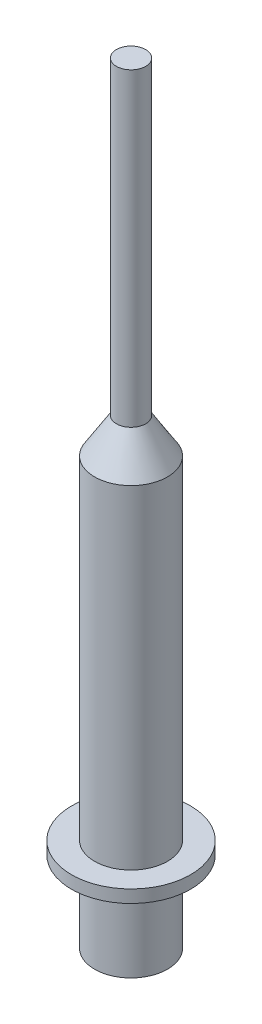
ISO-10303-21;
HEADER;
FILE_DESCRIPTION(('STEP AP214'),'2;1');
FILE_NAME('part.step','',(''),(''),'','','');
FILE_SCHEMA(('AUTOMOTIVE_DESIGN { 1 0 10303 214 1 1 1 1 }'));
ENDSEC;
DATA;
#1=APPLICATION_CONTEXT('core data for automotive mechanical design processes');
#2=APPLICATION_PROTOCOL_DEFINITION('international standard','automotive_design',2000,#1);
#3=PRODUCT_CONTEXT('',#1,'mechanical');
#4=PRODUCT('Part','Part','',(#3));
#5=PRODUCT_RELATED_PRODUCT_CATEGORY('part','',(#4));
#6=PRODUCT_DEFINITION_FORMATION('','',#4);
#7=PRODUCT_DEFINITION_CONTEXT('part definition',#1,'design');
#8=PRODUCT_DEFINITION('design','',#6,#7);
#9=PRODUCT_DEFINITION_SHAPE('','',#8);
#10=(LENGTH_UNIT() NAMED_UNIT(*) SI_UNIT(.MILLI.,.METRE.));
#11=(NAMED_UNIT(*) PLANE_ANGLE_UNIT() SI_UNIT($,.RADIAN.));
#12=(NAMED_UNIT(*) SI_UNIT($,.STERADIAN.) SOLID_ANGLE_UNIT());
#13=UNCERTAINTY_MEASURE_WITH_UNIT(LENGTH_MEASURE(1.E-05),#10,'distance_accuracy_value','');
#14=(GEOMETRIC_REPRESENTATION_CONTEXT(3) GLOBAL_UNCERTAINTY_ASSIGNED_CONTEXT((#13)) GLOBAL_UNIT_ASSIGNED_CONTEXT((#10,
#11,#12)) REPRESENTATION_CONTEXT('',''));
#15=CARTESIAN_POINT('',(0.,0.,0.));
#16=DIRECTION('',(0.,0.,1.));
#17=DIRECTION('',(1.,0.,0.));
#18=AXIS2_PLACEMENT_3D('',#15,#16,#17);
#19=CARTESIAN_POINT('',(0.,46.355,0.));
#20=DIRECTION('',(0.,-1.,0.));
#21=DIRECTION('',(0.,0.,-1.));
#22=AXIS2_PLACEMENT_3D('',#19,#20,#21);
#23=CYLINDRICAL_SURFACE('',#22,3.9624);
#24=CARTESIAN_POINT('',(0.,46.355,0.));
#25=DIRECTION('',(0.,-1.,0.));
#26=DIRECTION('',(0.,0.,-1.));
#27=AXIS2_PLACEMENT_3D('',#24,#25,#26);
#28=CIRCLE('',#27,3.9624);
#29=CARTESIAN_POINT('',(0.,46.355,-3.9624));
#30=VERTEX_POINT('',#29);
#31=EDGE_CURVE('E42',#30,#30,#28,.F.);
#32=CARTESIAN_POINT('',(0.,10.16,0.));
#33=DIRECTION('',(0.,-1.,0.));
#34=DIRECTION('',(0.,0.,-1.));
#35=AXIS2_PLACEMENT_3D('',#32,#33,#34);
#36=CIRCLE('',#35,3.9624);
#37=CARTESIAN_POINT('',(0.,10.16,-3.9624));
#38=VERTEX_POINT('',#37);
#39=EDGE_CURVE('E11',#38,#38,#36,.T.);
#40=CARTESIAN_POINT('',(0.,46.355,-3.9624));
#41=CARTESIAN_POINT('',(0.,45.97796875,-3.9624));
#42=CARTESIAN_POINT('',(0.,45.6009375,-3.9624));
#43=CARTESIAN_POINT('',(0.,44.846875,-3.9624));
#44=CARTESIAN_POINT('',(0.,44.46984375,-3.9624));
#45=CARTESIAN_POINT('',(0.,43.71578125,-3.9624));
#46=CARTESIAN_POINT('',(0.,43.33875,-3.9624));
#47=CARTESIAN_POINT('',(0.,42.5846875,-3.9624));
#48=CARTESIAN_POINT('',(0.,42.20765625,-3.9624));
#49=CARTESIAN_POINT('',(0.,41.45359375,-3.9624));
#50=CARTESIAN_POINT('',(0.,41.0765625,-3.9624));
#51=CARTESIAN_POINT('',(0.,40.3225,-3.9624));
#52=CARTESIAN_POINT('',(0.,39.94546875,-3.9624));
#53=CARTESIAN_POINT('',(0.,39.19140625,-3.9624));
#54=CARTESIAN_POINT('',(0.,38.814375,-3.9624));
#55=CARTESIAN_POINT('',(0.,38.0603125,-3.9624));
#56=CARTESIAN_POINT('',(0.,37.68328125,-3.9624));
#57=CARTESIAN_POINT('',(0.,36.92921875,-3.9624));
#58=CARTESIAN_POINT('',(0.,36.5521875,-3.9624));
#59=CARTESIAN_POINT('',(0.,35.798125,-3.9624));
#60=CARTESIAN_POINT('',(0.,35.42109375,-3.9624));
#61=CARTESIAN_POINT('',(0.,34.66703125,-3.9624));
#62=CARTESIAN_POINT('',(0.,34.29,-3.9624));
#63=CARTESIAN_POINT('',(0.,33.5359375,-3.9624));
#64=CARTESIAN_POINT('',(0.,33.15890625,-3.9624));
#65=CARTESIAN_POINT('',(0.,32.40484375,-3.9624));
#66=CARTESIAN_POINT('',(0.,32.0278125,-3.9624));
#67=CARTESIAN_POINT('',(0.,31.27375,-3.9624));
#68=CARTESIAN_POINT('',(0.,30.89671875,-3.9624));
#69=CARTESIAN_POINT('',(0.,30.14265625,-3.9624));
#70=CARTESIAN_POINT('',(0.,29.765625,-3.9624));
#71=CARTESIAN_POINT('',(0.,29.0115625,-3.9624));
#72=CARTESIAN_POINT('',(0.,28.63453125,-3.9624));
#73=CARTESIAN_POINT('',(0.,27.88046875,-3.9624));
#74=CARTESIAN_POINT('',(0.,27.5034375,-3.9624));
#75=CARTESIAN_POINT('',(0.,26.749375,-3.9624));
#76=CARTESIAN_POINT('',(0.,26.37234375,-3.9624));
#77=CARTESIAN_POINT('',(0.,25.61828125,-3.9624));
#78=CARTESIAN_POINT('',(0.,25.24125,-3.9624));
#79=CARTESIAN_POINT('',(0.,24.4871875,-3.9624));
#80=CARTESIAN_POINT('',(0.,24.11015625,-3.9624));
#81=CARTESIAN_POINT('',(0.,23.35609375,-3.9624));
#82=CARTESIAN_POINT('',(0.,22.9790625,-3.9624));
#83=CARTESIAN_POINT('',(0.,22.225,-3.9624));
#84=CARTESIAN_POINT('',(0.,21.84796875,-3.9624));
#85=CARTESIAN_POINT('',(0.,21.09390625,-3.9624));
#86=CARTESIAN_POINT('',(0.,20.716875,-3.9624));
#87=CARTESIAN_POINT('',(0.,19.9628125,-3.9624));
#88=CARTESIAN_POINT('',(0.,19.58578125,-3.9624));
#89=CARTESIAN_POINT('',(0.,18.83171875,-3.9624));
#90=CARTESIAN_POINT('',(0.,18.4546875,-3.9624));
#91=CARTESIAN_POINT('',(0.,17.700625,-3.9624));
#92=CARTESIAN_POINT('',(0.,17.32359375,-3.9624));
#93=CARTESIAN_POINT('',(0.,16.56953125,-3.9624));
#94=CARTESIAN_POINT('',(0.,16.1925,-3.9624));
#95=CARTESIAN_POINT('',(0.,15.4384375,-3.9624));
#96=CARTESIAN_POINT('',(0.,15.06140625,-3.9624));
#97=CARTESIAN_POINT('',(0.,14.30734375,-3.9624));
#98=CARTESIAN_POINT('',(0.,13.9303125,-3.9624));
#99=CARTESIAN_POINT('',(0.,13.17625,-3.9624));
#100=CARTESIAN_POINT('',(0.,12.79921875,-3.9624));
#101=CARTESIAN_POINT('',(0.,12.04515625,-3.9624));
#102=CARTESIAN_POINT('',(0.,11.668125,-3.9624));
#103=CARTESIAN_POINT('',(0.,10.9140625,-3.9624));
#104=CARTESIAN_POINT('',(0.,10.53703125,-3.9624));
#105=CARTESIAN_POINT('',(0.,10.16,-3.9624));
#106=B_SPLINE_CURVE_WITH_KNOTS('',3,(#40,#41,#42,#43,#44,#45,#46,#47,#48,#49,#50,#51,#52,#53,
#54,#55,#56,#57,#58,#59,#60,#61,#62,#63,#64,#65,#66,#67,#68,#69,#70,#71,#72,#73,#74,#75,#76,#77,
#78,#79,#80,#81,#82,#83,#84,#85,#86,#87,#88,#89,#90,#91,#92,#93,#94,#95,#96,#97,#98,#99,#100,
#101,#102,#103,#104,#105),.UNSPECIFIED.,.F.,.F.,(4,2,2,2,2,2,2,2,2,2,2,2,2,2,2,2,2,2,2,2,2,2,2,
2,2,2,2,2,2,2,2,2,4),(0.,1.13109375,2.2621875,3.39328125,4.524375,5.65546875,6.7865625,
7.91765624999999,9.04874999999999,10.17984375,11.3109375,12.44203125,13.573125,14.70421875,
15.8353125,16.96640625,18.0975,19.22859375,20.3596875,21.49078125,22.621875,23.75296875,
24.8840625,26.01515625,27.14625,28.27734375,29.4084375,30.53953125,31.670625,32.80171875,
33.9328125,35.06390625,36.195),.UNSPECIFIED.);
#107=EDGE_CURVE('BSEAM34',#30,#38,#106,.T.);
#108=ORIENTED_EDGE('',*,*,#31,.F.);
#109=ORIENTED_EDGE('',*,*,#39,.F.);
#110=ORIENTED_EDGE('',*,*,#107,.T.);
#111=ORIENTED_EDGE('',*,*,#107,.F.);
#112=EDGE_LOOP('',(#108,#110,#109,#111));
#113=FACE_BOUND('',#112,.T.);
#114=ADVANCED_FACE('F34',(#113),#23,.T.);
#115=CARTESIAN_POINT('',(0.,50.165,0.));
#116=DIRECTION('',(0.,-1.,0.));
#117=DIRECTION('',(0.,0.,-1.));
#118=AXIS2_PLACEMENT_3D('',#115,#116,#117);
#119=CONICAL_SURFACE('',#118,1.5875,0.557399915618848);
#120=ORIENTED_EDGE('',*,*,#31,.T.);
#121=EDGE_LOOP('',(#120));
#122=FACE_BOUND('',#121,.T.);
#123=CARTESIAN_POINT('',(0.,50.165,0.));
#124=DIRECTION('',(0.,1.,0.));
#125=DIRECTION('',(0.,0.,1.));
#126=AXIS2_PLACEMENT_3D('',#123,#124,#125);
#127=CIRCLE('',#126,1.5875);
#128=CARTESIAN_POINT('',(0.,50.165,1.5875));
#129=VERTEX_POINT('',#128);
#130=EDGE_CURVE('E49',#129,#129,#127,.T.);
#131=ORIENTED_EDGE('',*,*,#130,.F.);
#132=EDGE_LOOP('',(#131));
#133=FACE_BOUND('',#132,.T.);
#134=ADVANCED_FACE('F72',(#122,#133),#119,.T.);
#135=CARTESIAN_POINT('',(0.,83.82,0.));
#136=DIRECTION('',(0.,-1.,0.));
#137=DIRECTION('',(0.,0.,-1.));
#138=AXIS2_PLACEMENT_3D('',#135,#136,#137);
#139=CYLINDRICAL_SURFACE('',#138,1.5875);
#140=CARTESIAN_POINT('',(0.,83.82,0.));
#141=DIRECTION('',(0.,1.,0.));
#142=DIRECTION('',(0.,0.,1.));
#143=AXIS2_PLACEMENT_3D('',#140,#141,#142);
#144=CIRCLE('',#143,1.5875);
#145=CARTESIAN_POINT('',(0.,83.82,1.5875));
#146=VERTEX_POINT('',#145);
#147=EDGE_CURVE('E53',#146,#146,#144,.T.);
#148=ORIENTED_EDGE('',*,*,#147,.F.);
#149=EDGE_LOOP('',(#148));
#150=FACE_BOUND('',#149,.T.);
#151=ORIENTED_EDGE('',*,*,#130,.T.);
#152=EDGE_LOOP('',(#151));
#153=FACE_BOUND('',#152,.T.);
#154=ADVANCED_FACE('F70',(#150,#153),#139,.T.);
#155=CARTESIAN_POINT('',(0.,83.82,0.));
#156=DIRECTION('',(0.,1.,0.));
#157=DIRECTION('',(0.,0.,1.));
#158=AXIS2_PLACEMENT_3D('',#155,#156,#157);
#159=PLANE('',#158);
#160=ORIENTED_EDGE('',*,*,#147,.T.);
#161=EDGE_LOOP('',(#160));
#162=FACE_BOUND('',#161,.T.);
#163=ADVANCED_FACE('F91',(#162),#159,.T.);
#164=CARTESIAN_POINT('',(0.,8.7884,0.));
#165=DIRECTION('',(0.,-1.,0.));
#166=DIRECTION('',(0.,0.,-1.));
#167=AXIS2_PLACEMENT_3D('',#164,#165,#166);
#168=PLANE('',#167);
#169=CARTESIAN_POINT('',(0.,8.7884,0.));
#170=DIRECTION('',(0.,-1.,0.));
#171=DIRECTION('',(0.,0.,-1.));
#172=AXIS2_PLACEMENT_3D('',#169,#170,#171);
#173=CIRCLE('',#172,6.477);
#174=CARTESIAN_POINT('',(0.,8.7884,-6.477));
#175=VERTEX_POINT('',#174);
#176=EDGE_CURVE('E79',#175,#175,#173,.T.);
#177=ORIENTED_EDGE('',*,*,#176,.T.);
#178=EDGE_LOOP('',(#177));
#179=FACE_BOUND('',#178,.T.);
#180=CARTESIAN_POINT('',(0.,8.7884,0.));
#181=DIRECTION('',(0.,-1.,0.));
#182=DIRECTION('',(0.,0.,-1.));
#183=AXIS2_PLACEMENT_3D('',#180,#181,#182);
#184=CIRCLE('',#183,3.9624);
#185=CARTESIAN_POINT('',(0.,8.7884,-3.9624));
#186=VERTEX_POINT('',#185);
#187=EDGE_CURVE('E38',#186,#186,#184,.T.);
#188=ORIENTED_EDGE('',*,*,#187,.F.);
#189=EDGE_LOOP('',(#188));
#190=FACE_BOUND('',#189,.T.);
#191=ADVANCED_FACE('F88',(#179,#190),#168,.T.);
#192=CARTESIAN_POINT('',(0.,10.16,0.));
#193=DIRECTION('',(0.,-1.,0.));
#194=DIRECTION('',(0.,0.,-1.));
#195=AXIS2_PLACEMENT_3D('',#192,#193,#194);
#196=PLANE('',#195);
#197=CARTESIAN_POINT('',(0.,10.16,0.));
#198=DIRECTION('',(0.,-1.,0.));
#199=DIRECTION('',(0.,0.,-1.));
#200=AXIS2_PLACEMENT_3D('',#197,#198,#199);
#201=CIRCLE('',#200,6.477);
#202=CARTESIAN_POINT('',(0.,10.16,-6.477));
#203=VERTEX_POINT('',#202);
#204=EDGE_CURVE('E76',#203,#203,#201,.T.);
#205=ORIENTED_EDGE('',*,*,#204,.F.);
#206=EDGE_LOOP('',(#205));
#207=FACE_BOUND('',#206,.T.);
#208=ORIENTED_EDGE('',*,*,#39,.T.);
#209=EDGE_LOOP('',(#208));
#210=FACE_BOUND('',#209,.T.);
#211=ADVANCED_FACE('F90',(#207,#210),#196,.F.);
#212=CARTESIAN_POINT('',(0.,8.7884,0.));
#213=DIRECTION('',(0.,1.,0.));
#214=DIRECTION('',(0.,0.,1.));
#215=AXIS2_PLACEMENT_3D('',#212,#213,#214);
#216=CYLINDRICAL_SURFACE('',#215,6.477);
#217=ORIENTED_EDGE('',*,*,#176,.F.);
#218=EDGE_LOOP('',(#217));
#219=FACE_BOUND('',#218,.T.);
#220=ORIENTED_EDGE('',*,*,#204,.T.);
#221=EDGE_LOOP('',(#220));
#222=FACE_BOUND('',#221,.T.);
#223=ADVANCED_FACE('F97',(#219,#222),#216,.T.);
#224=CARTESIAN_POINT('',(0.,0.,0.));
#225=DIRECTION('',(0.,1.,0.));
#226=DIRECTION('',(0.,0.,1.));
#227=AXIS2_PLACEMENT_3D('',#224,#225,#226);
#228=PLANE('',#227);
#229=CARTESIAN_POINT('',(0.,0.,0.));
#230=DIRECTION('',(0.,1.,0.));
#231=DIRECTION('',(0.,0.,1.));
#232=AXIS2_PLACEMENT_3D('',#229,#230,#231);
#233=CIRCLE('',#232,3.9624);
#234=CARTESIAN_POINT('',(0.,0.,-3.9624));
#235=VERTEX_POINT('',#234);
#236=EDGE_CURVE('E46',#235,#235,#233,.T.);
#237=ORIENTED_EDGE('',*,*,#236,.F.);
#238=EDGE_LOOP('',(#237));
#239=FACE_BOUND('',#238,.T.);
#240=ADVANCED_FACE('F111',(#239),#228,.F.);
#241=CARTESIAN_POINT('',(0.,8.7884,-3.9624));
#242=CARTESIAN_POINT('',(0.,8.69685416666667,-3.9624));
#243=CARTESIAN_POINT('',(0.,8.60530833333333,-3.9624));
#244=CARTESIAN_POINT('',(0.,8.42221666666667,-3.9624));
#245=CARTESIAN_POINT('',(0.,8.33067083333333,-3.9624));
#246=CARTESIAN_POINT('',(0.,8.14757916666667,-3.9624));
#247=CARTESIAN_POINT('',(0.,8.05603333333333,-3.9624));
#248=CARTESIAN_POINT('',(0.,7.87294166666667,-3.9624));
#249=CARTESIAN_POINT('',(0.,7.78139583333333,-3.9624));
#250=CARTESIAN_POINT('',(0.,7.59830416666667,-3.9624));
#251=CARTESIAN_POINT('',(0.,7.50675833333334,-3.9624));
#252=CARTESIAN_POINT('',(0.,7.32366666666667,-3.9624));
#253=CARTESIAN_POINT('',(0.,7.23212083333334,-3.9624));
#254=CARTESIAN_POINT('',(0.,7.04902916666667,-3.9624));
#255=CARTESIAN_POINT('',(0.,6.95748333333334,-3.9624));
#256=CARTESIAN_POINT('',(0.,6.77439166666667,-3.9624));
#257=CARTESIAN_POINT('',(0.,6.68284583333334,-3.9624));
#258=CARTESIAN_POINT('',(0.,6.49975416666667,-3.9624));
#259=CARTESIAN_POINT('',(0.,6.40820833333333,-3.9624));
#260=CARTESIAN_POINT('',(0.,6.22511666666667,-3.9624));
#261=CARTESIAN_POINT('',(0.,6.13357083333333,-3.9624));
#262=CARTESIAN_POINT('',(0.,5.95047916666667,-3.9624));
#263=CARTESIAN_POINT('',(0.,5.85893333333333,-3.9624));
#264=CARTESIAN_POINT('',(0.,5.67584166666667,-3.9624));
#265=CARTESIAN_POINT('',(0.,5.58429583333334,-3.9624));
#266=CARTESIAN_POINT('',(0.,5.40120416666667,-3.9624));
#267=CARTESIAN_POINT('',(0.,5.30965833333334,-3.9624));
#268=CARTESIAN_POINT('',(0.,5.12656666666667,-3.9624));
#269=CARTESIAN_POINT('',(0.,5.03502083333334,-3.9624));
#270=CARTESIAN_POINT('',(0.,4.85192916666667,-3.9624));
#271=CARTESIAN_POINT('',(0.,4.76038333333334,-3.9624));
#272=CARTESIAN_POINT('',(0.,4.57729166666667,-3.9624));
#273=CARTESIAN_POINT('',(0.,4.48574583333333,-3.9624));
#274=CARTESIAN_POINT('',(0.,4.30265416666667,-3.9624));
#275=CARTESIAN_POINT('',(0.,4.21110833333333,-3.9624));
#276=CARTESIAN_POINT('',(0.,4.02801666666667,-3.9624));
#277=CARTESIAN_POINT('',(0.,3.93647083333333,-3.9624));
#278=CARTESIAN_POINT('',(0.,3.75337916666667,-3.9624));
#279=CARTESIAN_POINT('',(0.,3.66183333333333,-3.9624));
#280=CARTESIAN_POINT('',(0.,3.47874166666666,-3.9624));
#281=CARTESIAN_POINT('',(0.,3.38719583333333,-3.9624));
#282=CARTESIAN_POINT('',(0.,3.20410416666667,-3.9624));
#283=CARTESIAN_POINT('',(0.,3.11255833333333,-3.9624));
#284=CARTESIAN_POINT('',(0.,2.92946666666667,-3.9624));
#285=CARTESIAN_POINT('',(0.,2.83792083333334,-3.9624));
#286=CARTESIAN_POINT('',(0.,2.65482916666667,-3.9624));
#287=CARTESIAN_POINT('',(0.,2.56328333333333,-3.9624));
#288=CARTESIAN_POINT('',(0.,2.38019166666667,-3.9624));
#289=CARTESIAN_POINT('',(0.,2.28864583333333,-3.9624));
#290=CARTESIAN_POINT('',(0.,2.10555416666667,-3.9624));
#291=CARTESIAN_POINT('',(0.,2.01400833333333,-3.9624));
#292=CARTESIAN_POINT('',(0.,1.83091666666667,-3.9624));
#293=CARTESIAN_POINT('',(0.,1.73937083333333,-3.9624));
#294=CARTESIAN_POINT('',(0.,1.55627916666667,-3.9624));
#295=CARTESIAN_POINT('',(0.,1.46473333333333,-3.9624));
#296=CARTESIAN_POINT('',(0.,1.28164166666667,-3.9624));
#297=CARTESIAN_POINT('',(0.,1.19009583333334,-3.9624));
#298=CARTESIAN_POINT('',(0.,1.00700416666667,-3.9624));
#299=CARTESIAN_POINT('',(0.,0.915458333333332,-3.9624));
#300=CARTESIAN_POINT('',(0.,0.732366666666665,-3.9624));
#301=CARTESIAN_POINT('',(0.,0.640820833333333,-3.9624));
#302=CARTESIAN_POINT('',(0.,0.457729166666668,-3.9624));
#303=CARTESIAN_POINT('',(0.,0.366183333333335,-3.9624));
#304=CARTESIAN_POINT('',(0.,0.183091666666667,-3.9624));
#305=CARTESIAN_POINT('',(0.,0.0915458333333336,-3.9624));
#306=CARTESIAN_POINT('',(0.,0.,-3.9624));
#307=B_SPLINE_CURVE_WITH_KNOTS('',3,(#241,#242,#243,#244,#245,#246,#247,#248,#249,#250,#251,
#252,#253,#254,#255,#256,#257,#258,#259,#260,#261,#262,#263,#264,#265,#266,#267,#268,#269,#270,
#271,#272,#273,#274,#275,#276,#277,#278,#279,#280,#281,#282,#283,#284,#285,#286,#287,#288,#289,
#290,#291,#292,#293,#294,#295,#296,#297,#298,#299,#300,#301,#302,#303,#304,#305,#306),
.UNSPECIFIED.,.F.,.F.,(4,2,2,2,2,2,2,2,2,2,2,2,2,2,2,2,2,2,2,2,2,2,2,2,2,2,2,2,2,2,2,2,4),(0.,
0.274637500000001,0.549275000000002,0.823912500000003,1.09855,1.3731875,1.647825,1.9224625,
2.1971,2.4717375,2.746375,3.0210125,3.29565,3.5702875,3.844925,4.1195625,4.3942,4.6688375,
4.943475,5.2181125,5.49275,5.7673875,6.042025,6.3166625,6.5913,6.8659375,7.140575,7.4152125,
7.68985,7.96448750000001,8.239125,8.5137625,8.7884),.UNSPECIFIED.);
#308=EDGE_CURVE('BSEAM36',#186,#235,#307,.T.);
#309=ORIENTED_EDGE('',*,*,#187,.T.);
#310=ORIENTED_EDGE('',*,*,#236,.T.);
#311=ORIENTED_EDGE('',*,*,#308,.T.);
#312=ORIENTED_EDGE('',*,*,#308,.F.);
#313=EDGE_LOOP('',(#309,#311,#310,#312));
#314=FACE_BOUND('',#313,.T.);
#315=ADVANCED_FACE('F36',(#314),#23,.T.);
#316=CLOSED_SHELL('',(#114,#134,#154,#163,#191,#211,#223,#240,#315));
#317=MANIFOLD_SOLID_BREP('B2',#316);
#318=ADVANCED_BREP_SHAPE_REPRESENTATION('',(#18,#317),#14);
#319=SHAPE_DEFINITION_REPRESENTATION(#9,#318);
ENDSEC;
END-ISO-10303-21;
